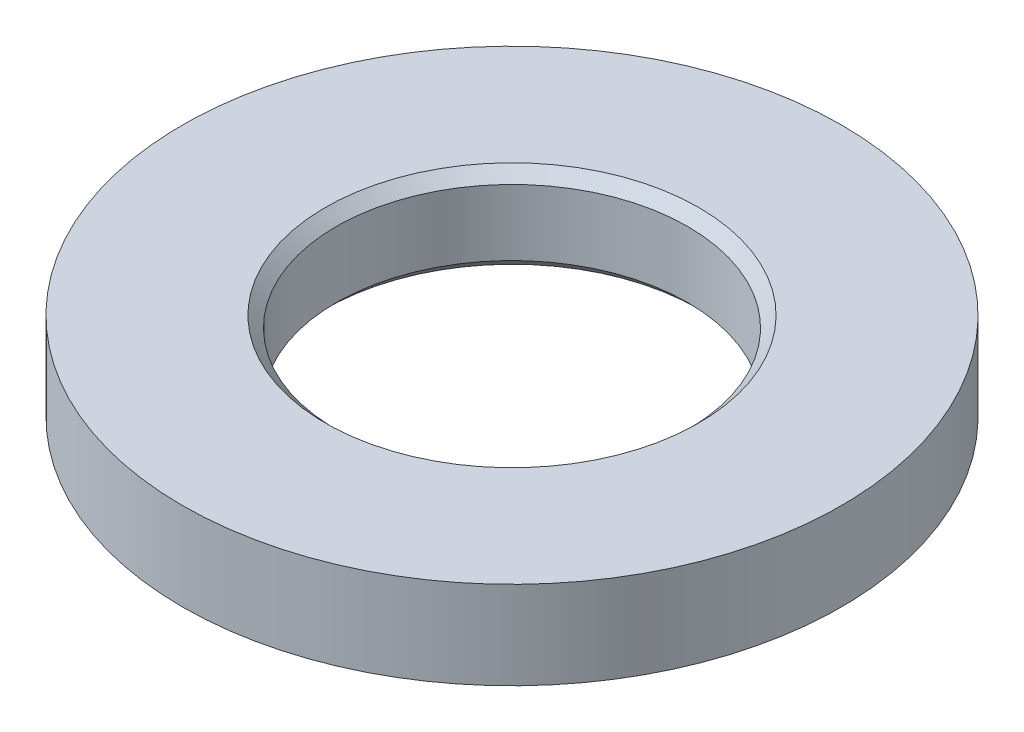
ISO-10303-21;
HEADER;
FILE_DESCRIPTION(('STEP AP214'),'2;1');
FILE_NAME('part.step','',(''),(''),'','','');
FILE_SCHEMA(('AUTOMOTIVE_DESIGN { 1 0 10303 214 1 1 1 1 }'));
ENDSEC;
DATA;
#1=APPLICATION_CONTEXT('core data for automotive mechanical design processes');
#2=APPLICATION_PROTOCOL_DEFINITION('international standard','automotive_design',2000,#1);
#3=PRODUCT_CONTEXT('',#1,'mechanical');
#4=PRODUCT('Part','Part','',(#3));
#5=PRODUCT_RELATED_PRODUCT_CATEGORY('part','',(#4));
#6=PRODUCT_DEFINITION_FORMATION('','',#4);
#7=PRODUCT_DEFINITION_CONTEXT('part definition',#1,'design');
#8=PRODUCT_DEFINITION('design','',#6,#7);
#9=PRODUCT_DEFINITION_SHAPE('','',#8);
#10=(LENGTH_UNIT() NAMED_UNIT(*) SI_UNIT(.MILLI.,.METRE.));
#11=(NAMED_UNIT(*) PLANE_ANGLE_UNIT() SI_UNIT($,.RADIAN.));
#12=(NAMED_UNIT(*) SI_UNIT($,.STERADIAN.) SOLID_ANGLE_UNIT());
#13=UNCERTAINTY_MEASURE_WITH_UNIT(LENGTH_MEASURE(1.E-05),#10,'distance_accuracy_value','');
#14=(GEOMETRIC_REPRESENTATION_CONTEXT(3) GLOBAL_UNCERTAINTY_ASSIGNED_CONTEXT((#13)) GLOBAL_UNIT_ASSIGNED_CONTEXT((#10,
#11,#12)) REPRESENTATION_CONTEXT('',''));
#15=CARTESIAN_POINT('',(0.,0.,0.));
#16=DIRECTION('',(0.,0.,1.));
#17=DIRECTION('',(1.,0.,0.));
#18=AXIS2_PLACEMENT_3D('',#15,#16,#17);
#19=CARTESIAN_POINT('',(0.,0.2,0.));
#20=DIRECTION('',(0.,-1.,0.));
#21=DIRECTION('',(0.,0.,-1.));
#22=AXIS2_PLACEMENT_3D('',#19,#20,#21);
#23=CONICAL_SURFACE('',#22,3.2,0.785398163397448);
#24=CARTESIAN_POINT('',(0.,0.,0.));
#25=DIRECTION('',(0.,-1.,0.));
#26=DIRECTION('',(0.,0.,-1.));
#27=AXIS2_PLACEMENT_3D('',#24,#25,#26);
#28=CIRCLE('',#27,3.4);
#29=CARTESIAN_POINT('',(0.,0.,-3.4));
#30=VERTEX_POINT('',#29);
#31=EDGE_CURVE('E10',#30,#30,#28,.T.);
#32=ORIENTED_EDGE('',*,*,#31,.T.);
#33=EDGE_LOOP('',(#32));
#34=FACE_BOUND('',#33,.T.);
#35=CARTESIAN_POINT('',(0.,0.2,0.));
#36=DIRECTION('',(0.,-1.,0.));
#37=DIRECTION('',(0.,0.,-1.));
#38=AXIS2_PLACEMENT_3D('',#35,#36,#37);
#39=CIRCLE('',#38,3.2);
#40=CARTESIAN_POINT('',(0.,0.2,-3.2));
#41=VERTEX_POINT('',#40);
#42=EDGE_CURVE('E48',#41,#41,#39,.T.);
#43=ORIENTED_EDGE('',*,*,#42,.F.);
#44=EDGE_LOOP('',(#43));
#45=FACE_BOUND('',#44,.T.);
#46=ADVANCED_FACE('F14',(#34,#45),#23,.F.);
#47=CARTESIAN_POINT('',(3.4,0.,0.));
#48=DIRECTION('',(0.,-1.,0.));
#49=DIRECTION('',(0.,0.,-1.));
#50=AXIS2_PLACEMENT_3D('',#47,#48,#49);
#51=PLANE('',#50);
#52=CARTESIAN_POINT('',(0.,0.,0.));
#53=DIRECTION('',(0.,-1.,0.));
#54=DIRECTION('',(0.,0.,-1.));
#55=AXIS2_PLACEMENT_3D('',#52,#53,#54);
#56=CIRCLE('',#55,6.);
#57=CARTESIAN_POINT('',(0.,0.,-6.));
#58=VERTEX_POINT('',#57);
#59=EDGE_CURVE('E21',#58,#58,#56,.T.);
#60=ORIENTED_EDGE('',*,*,#59,.T.);
#61=EDGE_LOOP('',(#60));
#62=FACE_BOUND('',#61,.T.);
#63=ORIENTED_EDGE('',*,*,#31,.F.);
#64=EDGE_LOOP('',(#63));
#65=FACE_BOUND('',#64,.T.);
#66=ADVANCED_FACE('F57',(#62,#65),#51,.T.);
#67=CARTESIAN_POINT('',(0.,0.,0.));
#68=DIRECTION('',(0.,-1.,0.));
#69=DIRECTION('',(0.,0.,-1.));
#70=AXIS2_PLACEMENT_3D('',#67,#68,#69);
#71=CYLINDRICAL_SURFACE('',#70,6.);
#72=CARTESIAN_POINT('',(0.,1.6,0.));
#73=DIRECTION('',(0.,-1.,0.));
#74=DIRECTION('',(0.,0.,-1.));
#75=AXIS2_PLACEMENT_3D('',#72,#73,#74);
#76=CIRCLE('',#75,6.);
#77=CARTESIAN_POINT('',(0.,1.6,-6.));
#78=VERTEX_POINT('',#77);
#79=EDGE_CURVE('E30',#78,#78,#76,.T.);
#80=ORIENTED_EDGE('',*,*,#79,.T.);
#81=EDGE_LOOP('',(#80));
#82=FACE_BOUND('',#81,.T.);
#83=ORIENTED_EDGE('',*,*,#59,.F.);
#84=EDGE_LOOP('',(#83));
#85=FACE_BOUND('',#84,.T.);
#86=ADVANCED_FACE('F62',(#82,#85),#71,.T.);
#87=CARTESIAN_POINT('',(6.,1.6,0.));
#88=DIRECTION('',(0.,1.,0.));
#89=DIRECTION('',(0.,0.,1.));
#90=AXIS2_PLACEMENT_3D('',#87,#88,#89);
#91=PLANE('',#90);
#92=CARTESIAN_POINT('',(0.,1.6,0.));
#93=DIRECTION('',(0.,-1.,0.));
#94=DIRECTION('',(0.,0.,-1.));
#95=AXIS2_PLACEMENT_3D('',#92,#93,#94);
#96=CIRCLE('',#95,3.4);
#97=CARTESIAN_POINT('',(0.,1.6,-3.4));
#98=VERTEX_POINT('',#97);
#99=EDGE_CURVE('E38',#98,#98,#96,.T.);
#100=ORIENTED_EDGE('',*,*,#99,.T.);
#101=EDGE_LOOP('',(#100));
#102=FACE_BOUND('',#101,.T.);
#103=ORIENTED_EDGE('',*,*,#79,.F.);
#104=EDGE_LOOP('',(#103));
#105=FACE_BOUND('',#104,.T.);
#106=ADVANCED_FACE('F66',(#102,#105),#91,.T.);
#107=CARTESIAN_POINT('',(0.,1.6,0.));
#108=DIRECTION('',(0.,1.,0.));
#109=DIRECTION('',(0.,0.,1.));
#110=AXIS2_PLACEMENT_3D('',#107,#108,#109);
#111=CONICAL_SURFACE('',#110,3.4,0.785398163397448);
#112=CARTESIAN_POINT('',(0.,1.4,0.));
#113=DIRECTION('',(0.,-1.,0.));
#114=DIRECTION('',(0.,0.,-1.));
#115=AXIS2_PLACEMENT_3D('',#112,#113,#114);
#116=CIRCLE('',#115,3.2);
#117=CARTESIAN_POINT('',(0.,1.4,-3.2));
#118=VERTEX_POINT('',#117);
#119=EDGE_CURVE('E44',#118,#118,#116,.T.);
#120=ORIENTED_EDGE('',*,*,#119,.T.);
#121=EDGE_LOOP('',(#120));
#122=FACE_BOUND('',#121,.T.);
#123=ORIENTED_EDGE('',*,*,#99,.F.);
#124=EDGE_LOOP('',(#123));
#125=FACE_BOUND('',#124,.T.);
#126=ADVANCED_FACE('F73',(#122,#125),#111,.F.);
#127=CARTESIAN_POINT('',(0.,0.,0.));
#128=DIRECTION('',(0.,-1.,0.));
#129=DIRECTION('',(0.,0.,-1.));
#130=AXIS2_PLACEMENT_3D('',#127,#128,#129);
#131=CYLINDRICAL_SURFACE('',#130,3.2);
#132=ORIENTED_EDGE('',*,*,#42,.T.);
#133=EDGE_LOOP('',(#132));
#134=FACE_BOUND('',#133,.T.);
#135=ORIENTED_EDGE('',*,*,#119,.F.);
#136=EDGE_LOOP('',(#135));
#137=FACE_BOUND('',#136,.T.);
#138=ADVANCED_FACE('F53',(#134,#137),#131,.F.);
#139=CLOSED_SHELL('',(#46,#66,#86,#106,#126,#138));
#140=MANIFOLD_SOLID_BREP('B1',#139);
#141=ADVANCED_BREP_SHAPE_REPRESENTATION('',(#18,#140),#14);
#142=SHAPE_DEFINITION_REPRESENTATION(#9,#141);
ENDSEC;
END-ISO-10303-21;
